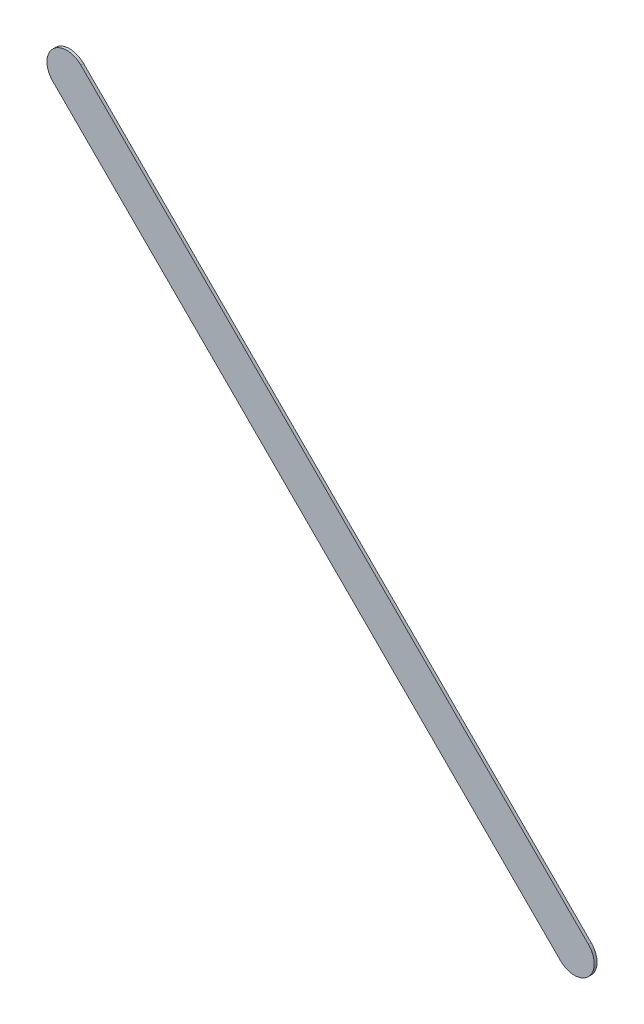
ISO-10303-21;
HEADER;
FILE_DESCRIPTION(('STEP AP214'),'2;1');
FILE_NAME('part.step','',(''),(''),'','','');
FILE_SCHEMA(('AUTOMOTIVE_DESIGN { 1 0 10303 214 1 1 1 1 }'));
ENDSEC;
DATA;
#1=APPLICATION_CONTEXT('core data for automotive mechanical design processes');
#2=APPLICATION_PROTOCOL_DEFINITION('international standard','automotive_design',2000,#1);
#3=PRODUCT_CONTEXT('',#1,'mechanical');
#4=PRODUCT('Part','Part','',(#3));
#5=PRODUCT_RELATED_PRODUCT_CATEGORY('part','',(#4));
#6=PRODUCT_DEFINITION_FORMATION('','',#4);
#7=PRODUCT_DEFINITION_CONTEXT('part definition',#1,'design');
#8=PRODUCT_DEFINITION('design','',#6,#7);
#9=PRODUCT_DEFINITION_SHAPE('','',#8);
#10=(LENGTH_UNIT() NAMED_UNIT(*) SI_UNIT(.MILLI.,.METRE.));
#11=(NAMED_UNIT(*) PLANE_ANGLE_UNIT() SI_UNIT($,.RADIAN.));
#12=(NAMED_UNIT(*) SI_UNIT($,.STERADIAN.) SOLID_ANGLE_UNIT());
#13=UNCERTAINTY_MEASURE_WITH_UNIT(LENGTH_MEASURE(1.E-05),#10,'distance_accuracy_value','');
#14=(GEOMETRIC_REPRESENTATION_CONTEXT(3) GLOBAL_UNCERTAINTY_ASSIGNED_CONTEXT((#13)) GLOBAL_UNIT_ASSIGNED_CONTEXT((#10,
#11,#12)) REPRESENTATION_CONTEXT('',''));
#15=CARTESIAN_POINT('',(0.,0.,0.));
#16=DIRECTION('',(0.,0.,1.));
#17=DIRECTION('',(1.,0.,0.));
#18=AXIS2_PLACEMENT_3D('',#15,#16,#17);
#19=CARTESIAN_POINT('',(107.72322372,88.32322442,0.));
#20=DIRECTION('',(0.707106781186546,0.707106781186549,0.));
#21=DIRECTION('',(0.707106781186549,-0.707106781186546,0.));
#22=AXIS2_PLACEMENT_3D('',#19,#20,#21);
#23=PLANE('',#22);
#24=DIRECTION('',(0.707106781186549,-0.707106781186546,0.));
#25=VECTOR('',#24,1.);
#26=CARTESIAN_POINT('',(107.72322372,88.32322442,0.03556));
#27=LINE('',#26,#25);
#28=CARTESIAN_POINT('',(107.72322372,88.32322442,0.03556));
#29=VERTEX_POINT('',#28);
#30=CARTESIAN_POINT('',(114.12321092,81.92323722,0.03556));
#31=VERTEX_POINT('',#30);
#32=EDGE_CURVE('E11',#29,#31,#27,.T.);
#33=ORIENTED_EDGE('',*,*,#32,.F.);
#34=DIRECTION('',(0.,0.,1.));
#35=VECTOR('',#34,1.);
#36=CARTESIAN_POINT('',(107.72322372,88.32322442,0.));
#37=LINE('',#36,#35);
#38=CARTESIAN_POINT('',(107.72322372,88.32322442,0.));
#39=VERTEX_POINT('',#38);
#40=EDGE_CURVE('E24',#39,#29,#37,.T.);
#41=ORIENTED_EDGE('',*,*,#40,.F.);
#42=DIRECTION('',(0.707106781186549,-0.707106781186546,0.));
#43=VECTOR('',#42,1.);
#44=CARTESIAN_POINT('',(107.72322372,88.32322442,0.));
#45=LINE('',#44,#43);
#46=CARTESIAN_POINT('',(114.12321092,81.92323722,0.));
#47=VERTEX_POINT('',#46);
#48=EDGE_CURVE('E75',#39,#47,#45,.T.);
#49=ORIENTED_EDGE('',*,*,#48,.T.);
#50=DIRECTION('',(0.,0.,1.));
#51=VECTOR('',#50,1.);
#52=CARTESIAN_POINT('',(114.12321092,81.92323722,0.));
#53=LINE('',#52,#51);
#54=EDGE_CURVE('E37',#47,#31,#53,.T.);
#55=ORIENTED_EDGE('',*,*,#54,.T.);
#56=EDGE_LOOP('',(#33,#41,#49,#55));
#57=FACE_BOUND('',#56,.T.);
#58=ADVANCED_FACE('F17',(#57),#23,.F.);
#59=CARTESIAN_POINT('',(114.2999873,82.1000136,0.));
#60=DIRECTION('',(0.,0.,-1.));
#61=DIRECTION('',(-0.707106781186519,-0.707106781186576,0.));
#62=AXIS2_PLACEMENT_3D('',#59,#60,#61);
#63=CYLINDRICAL_SURFACE('',#62,0.249999554103223);
#64=CARTESIAN_POINT('',(114.2999873,82.1000136,0.03556));
#65=DIRECTION('',(0.,0.,1.));
#66=DIRECTION('',(-0.707106781186519,-0.707106781186576,0.));
#67=AXIS2_PLACEMENT_3D('',#64,#65,#66);
#68=CIRCLE('',#67,0.249999554103223);
#69=CARTESIAN_POINT('',(114.47676368,82.27678998,0.03556));
#70=VERTEX_POINT('',#69);
#71=EDGE_CURVE('E83',#31,#70,#68,.T.);
#72=ORIENTED_EDGE('',*,*,#71,.F.);
#73=ORIENTED_EDGE('',*,*,#54,.F.);
#74=CARTESIAN_POINT('',(114.2999873,82.1000136,0.));
#75=DIRECTION('',(0.,0.,1.));
#76=DIRECTION('',(-0.707106781186519,-0.707106781186576,0.));
#77=AXIS2_PLACEMENT_3D('',#74,#75,#76);
#78=CIRCLE('',#77,0.249999554103223);
#79=CARTESIAN_POINT('',(114.47676368,82.27678998,0.));
#80=VERTEX_POINT('',#79);
#81=EDGE_CURVE('E81',#47,#80,#78,.T.);
#82=ORIENTED_EDGE('',*,*,#81,.T.);
#83=DIRECTION('',(0.,0.,1.));
#84=VECTOR('',#83,1.);
#85=CARTESIAN_POINT('',(114.47676368,82.27678998,0.));
#86=LINE('',#85,#84);
#87=EDGE_CURVE('E67',#80,#70,#86,.T.);
#88=ORIENTED_EDGE('',*,*,#87,.T.);
#89=EDGE_LOOP('',(#72,#73,#82,#88));
#90=FACE_BOUND('',#89,.T.);
#91=ADVANCED_FACE('F89',(#90),#63,.T.);
#92=CARTESIAN_POINT('',(114.47676368,82.27678998,0.));
#93=DIRECTION('',(-0.707106781186548,-0.707106781186548,0.));
#94=DIRECTION('',(-0.707106781186548,0.707106781186548,0.));
#95=AXIS2_PLACEMENT_3D('',#92,#93,#94);
#96=PLANE('',#95);
#97=DIRECTION('',(-0.707106781186548,0.707106781186548,0.));
#98=VECTOR('',#97,1.);
#99=CARTESIAN_POINT('',(114.47676368,82.27678998,0.03556));
#100=LINE('',#99,#98);
#101=CARTESIAN_POINT('',(108.07677648,88.67677718,0.03556));
#102=VERTEX_POINT('',#101);
#103=EDGE_CURVE('E71',#70,#102,#100,.T.);
#104=ORIENTED_EDGE('',*,*,#103,.F.);
#105=ORIENTED_EDGE('',*,*,#87,.F.);
#106=DIRECTION('',(-0.707106781186548,0.707106781186548,0.));
#107=VECTOR('',#106,1.);
#108=CARTESIAN_POINT('',(114.47676368,82.27678998,0.));
#109=LINE('',#108,#107);
#110=CARTESIAN_POINT('',(108.07677648,88.67677718,0.));
#111=VERTEX_POINT('',#110);
#112=EDGE_CURVE('E63',#80,#111,#109,.T.);
#113=ORIENTED_EDGE('',*,*,#112,.T.);
#114=DIRECTION('',(0.,0.,1.));
#115=VECTOR('',#114,1.);
#116=CARTESIAN_POINT('',(108.07677648,88.67677718,0.));
#117=LINE('',#116,#115);
#118=EDGE_CURVE('E53',#111,#102,#117,.T.);
#119=ORIENTED_EDGE('',*,*,#118,.T.);
#120=EDGE_LOOP('',(#104,#105,#113,#119));
#121=FACE_BOUND('',#120,.T.);
#122=ADVANCED_FACE('F66',(#121),#96,.F.);
#123=CARTESIAN_POINT('',(107.9000001,88.5000008,0.));
#124=DIRECTION('',(0.,0.,-1.));
#125=DIRECTION('',(0.707106781186576,0.707106781186519,0.));
#126=AXIS2_PLACEMENT_3D('',#123,#124,#125);
#127=CYLINDRICAL_SURFACE('',#126,0.24999955410323);
#128=CARTESIAN_POINT('',(107.9000001,88.5000008,0.03556));
#129=DIRECTION('',(0.,0.,1.));
#130=DIRECTION('',(0.707106781186576,0.707106781186519,0.));
#131=AXIS2_PLACEMENT_3D('',#128,#129,#130);
#132=CIRCLE('',#131,0.24999955410323);
#133=EDGE_CURVE('E59',#102,#29,#132,.T.);
#134=ORIENTED_EDGE('',*,*,#133,.F.);
#135=ORIENTED_EDGE('',*,*,#118,.F.);
#136=CARTESIAN_POINT('',(107.9000001,88.5000008,0.));
#137=DIRECTION('',(0.,0.,1.));
#138=DIRECTION('',(0.707106781186576,0.707106781186519,0.));
#139=AXIS2_PLACEMENT_3D('',#136,#137,#138);
#140=CIRCLE('',#139,0.24999955410323);
#141=EDGE_CURVE('E57',#111,#39,#140,.T.);
#142=ORIENTED_EDGE('',*,*,#141,.T.);
#143=ORIENTED_EDGE('',*,*,#40,.T.);
#144=EDGE_LOOP('',(#134,#135,#142,#143));
#145=FACE_BOUND('',#144,.T.);
#146=ADVANCED_FACE('F55',(#145),#127,.T.);
#147=CARTESIAN_POINT('',(107.72322372,88.32322442,0.));
#148=DIRECTION('',(0.,0.,-1.));
#149=DIRECTION('',(-1.,0.,0.));
#150=AXIS2_PLACEMENT_3D('',#147,#148,#149);
#151=PLANE('',#150);
#152=ORIENTED_EDGE('',*,*,#141,.F.);
#153=ORIENTED_EDGE('',*,*,#112,.F.);
#154=ORIENTED_EDGE('',*,*,#81,.F.);
#155=ORIENTED_EDGE('',*,*,#48,.F.);
#156=EDGE_LOOP('',(#152,#153,#154,#155));
#157=FACE_BOUND('',#156,.T.);
#158=ADVANCED_FACE('F74',(#157),#151,.T.);
#159=CARTESIAN_POINT('',(107.72322372,88.32322442,0.03556));
#160=DIRECTION('',(0.,0.,-1.));
#161=DIRECTION('',(-1.,0.,0.));
#162=AXIS2_PLACEMENT_3D('',#159,#160,#161);
#163=PLANE('',#162);
#164=ORIENTED_EDGE('',*,*,#32,.T.);
#165=ORIENTED_EDGE('',*,*,#71,.T.);
#166=ORIENTED_EDGE('',*,*,#103,.T.);
#167=ORIENTED_EDGE('',*,*,#133,.T.);
#168=EDGE_LOOP('',(#164,#165,#166,#167));
#169=FACE_BOUND('',#168,.T.);
#170=ADVANCED_FACE('F91',(#169),#163,.F.);
#171=CLOSED_SHELL('',(#58,#91,#122,#146,#158,#170));
#172=MANIFOLD_SOLID_BREP('B1',#171);
#173=ADVANCED_BREP_SHAPE_REPRESENTATION('',(#18,#172),#14);
#174=SHAPE_DEFINITION_REPRESENTATION(#9,#173);
ENDSEC;
END-ISO-10303-21;
